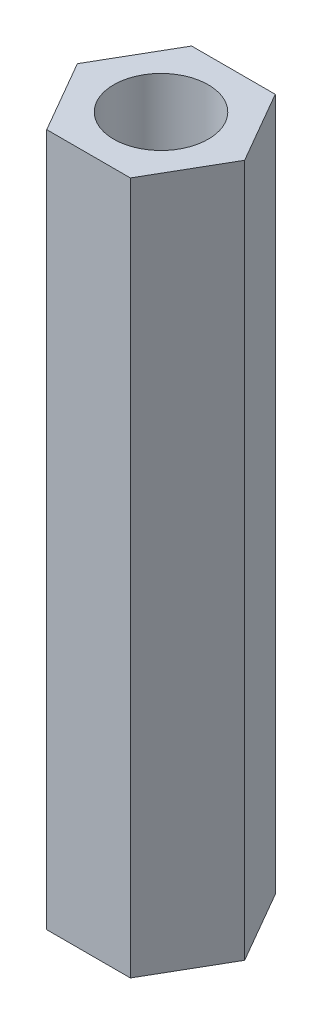
ISO-10303-21;
HEADER;
FILE_DESCRIPTION(('STEP AP214'),'2;1');
FILE_NAME('part.step','',(''),(''),'','','');
FILE_SCHEMA(('AUTOMOTIVE_DESIGN { 1 0 10303 214 1 1 1 1 }'));
ENDSEC;
DATA;
#1=APPLICATION_CONTEXT('core data for automotive mechanical design processes');
#2=APPLICATION_PROTOCOL_DEFINITION('international standard','automotive_design',2000,#1);
#3=PRODUCT_CONTEXT('',#1,'mechanical');
#4=PRODUCT('Part','Part','',(#3));
#5=PRODUCT_RELATED_PRODUCT_CATEGORY('part','',(#4));
#6=PRODUCT_DEFINITION_FORMATION('','',#4);
#7=PRODUCT_DEFINITION_CONTEXT('part definition',#1,'design');
#8=PRODUCT_DEFINITION('design','',#6,#7);
#9=PRODUCT_DEFINITION_SHAPE('','',#8);
#10=(LENGTH_UNIT() NAMED_UNIT(*) SI_UNIT(.MILLI.,.METRE.));
#11=(NAMED_UNIT(*) PLANE_ANGLE_UNIT() SI_UNIT($,.RADIAN.));
#12=(NAMED_UNIT(*) SI_UNIT($,.STERADIAN.) SOLID_ANGLE_UNIT());
#13=UNCERTAINTY_MEASURE_WITH_UNIT(LENGTH_MEASURE(1.E-05),#10,'distance_accuracy_value','');
#14=(GEOMETRIC_REPRESENTATION_CONTEXT(3) GLOBAL_UNCERTAINTY_ASSIGNED_CONTEXT((#13)) GLOBAL_UNIT_ASSIGNED_CONTEXT((#10,
#11,#12)) REPRESENTATION_CONTEXT('',''));
#15=CARTESIAN_POINT('',(0.,0.,0.));
#16=DIRECTION('',(0.,0.,1.));
#17=DIRECTION('',(1.,0.,0.));
#18=AXIS2_PLACEMENT_3D('',#15,#16,#17);
#19=CARTESIAN_POINT('',(2.65581123827228,22.,0.));
#20=DIRECTION('',(-0.866025403784438,0.,0.500000000000001));
#21=DIRECTION('',(0.500000000000001,0.,0.866025403784438));
#22=AXIS2_PLACEMENT_3D('',#19,#20,#21);
#23=PLANE('',#22);
#24=DIRECTION('',(0.,1.,0.));
#25=VECTOR('',#24,1.);
#26=CARTESIAN_POINT('',(1.32790561913614,22.,-2.3));
#27=LINE('',#26,#25);
#28=CARTESIAN_POINT('',(1.32790561913613,0.,-2.3));
#29=VERTEX_POINT('',#28);
#30=CARTESIAN_POINT('',(1.32790561913613,22.,-2.3));
#31=VERTEX_POINT('',#30);
#32=EDGE_CURVE('E83',#29,#31,#27,.T.);
#33=ORIENTED_EDGE('',*,*,#32,.T.);
#34=DIRECTION('',(-0.500000000000001,0.,-0.866025403784438));
#35=VECTOR('',#34,1.);
#36=CARTESIAN_POINT('',(2.65581123827228,22.,0.));
#37=LINE('',#36,#35);
#38=CARTESIAN_POINT('',(2.65581123827228,22.,0.));
#39=VERTEX_POINT('',#38);
#40=EDGE_CURVE('E79',#39,#31,#37,.T.);
#41=ORIENTED_EDGE('',*,*,#40,.F.);
#42=DIRECTION('',(0.,1.,0.));
#43=VECTOR('',#42,1.);
#44=CARTESIAN_POINT('',(2.65581123827228,22.,0.));
#45=LINE('',#44,#43);
#46=CARTESIAN_POINT('',(2.65581123827228,0.,0.));
#47=VERTEX_POINT('',#46);
#48=EDGE_CURVE('E67',#39,#47,#45,.F.);
#49=ORIENTED_EDGE('',*,*,#48,.T.);
#50=DIRECTION('',(-0.500000000000001,0.,-0.866025403784438));
#51=VECTOR('',#50,1.);
#52=CARTESIAN_POINT('',(2.65581123827228,0.,0.));
#53=LINE('',#52,#51);
#54=EDGE_CURVE('E116',#47,#29,#53,.T.);
#55=ORIENTED_EDGE('',*,*,#54,.T.);
#56=EDGE_LOOP('',(#33,#41,#49,#55));
#57=FACE_BOUND('',#56,.T.);
#58=ADVANCED_FACE('F16',(#57),#23,.F.);
#59=CARTESIAN_POINT('',(1.32790561913614,22.,-2.3));
#60=DIRECTION('',(0.,0.,1.));
#61=DIRECTION('',(1.,0.,0.));
#62=AXIS2_PLACEMENT_3D('',#59,#60,#61);
#63=PLANE('',#62);
#64=DIRECTION('',(0.,1.,0.));
#65=VECTOR('',#64,1.);
#66=CARTESIAN_POINT('',(-1.32790561913615,22.,-2.3));
#67=LINE('',#66,#65);
#68=CARTESIAN_POINT('',(-1.32790561913615,0.,-2.3));
#69=VERTEX_POINT('',#68);
#70=CARTESIAN_POINT('',(-1.32790561913615,22.,-2.3));
#71=VERTEX_POINT('',#70);
#72=EDGE_CURVE('E98',#69,#71,#67,.T.);
#73=ORIENTED_EDGE('',*,*,#72,.T.);
#74=DIRECTION('',(1.,0.,0.));
#75=VECTOR('',#74,1.);
#76=CARTESIAN_POINT('',(0.,22.,-2.3));
#77=LINE('',#76,#75);
#78=EDGE_CURVE('E85',#31,#71,#77,.F.);
#79=ORIENTED_EDGE('',*,*,#78,.F.);
#80=ORIENTED_EDGE('',*,*,#32,.F.);
#81=DIRECTION('',(1.,0.,0.));
#82=VECTOR('',#81,1.);
#83=CARTESIAN_POINT('',(0.,0.,-2.3));
#84=LINE('',#83,#82);
#85=EDGE_CURVE('E106',#29,#69,#84,.F.);
#86=ORIENTED_EDGE('',*,*,#85,.T.);
#87=EDGE_LOOP('',(#73,#79,#80,#86));
#88=FACE_BOUND('',#87,.T.);
#89=ADVANCED_FACE('F104',(#88),#63,.F.);
#90=CARTESIAN_POINT('',(-1.32790561913615,22.,-2.3));
#91=DIRECTION('',(0.866025403784442,0.,0.499999999999995));
#92=DIRECTION('',(0.499999999999995,0.,-0.866025403784442));
#93=AXIS2_PLACEMENT_3D('',#90,#91,#92);
#94=PLANE('',#93);
#95=DIRECTION('',(0.,1.,0.));
#96=VECTOR('',#95,1.);
#97=CARTESIAN_POINT('',(-2.65581123827228,22.,0.));
#98=LINE('',#97,#96);
#99=CARTESIAN_POINT('',(-2.65581123827228,0.,0.));
#100=VERTEX_POINT('',#99);
#101=CARTESIAN_POINT('',(-2.65581123827228,22.,0.));
#102=VERTEX_POINT('',#101);
#103=EDGE_CURVE('E95',#100,#102,#98,.T.);
#104=ORIENTED_EDGE('',*,*,#103,.T.);
#105=DIRECTION('',(-0.499999999999995,0.,0.866025403784442));
#106=VECTOR('',#105,1.);
#107=CARTESIAN_POINT('',(-1.32790561913615,22.,-2.3));
#108=LINE('',#107,#106);
#109=EDGE_CURVE('E87',#71,#102,#108,.T.);
#110=ORIENTED_EDGE('',*,*,#109,.F.);
#111=ORIENTED_EDGE('',*,*,#72,.F.);
#112=DIRECTION('',(-0.499999999999995,0.,0.866025403784442));
#113=VECTOR('',#112,1.);
#114=CARTESIAN_POINT('',(-1.32790561913615,0.,-2.3));
#115=LINE('',#114,#113);
#116=EDGE_CURVE('E119',#69,#100,#115,.T.);
#117=ORIENTED_EDGE('',*,*,#116,.T.);
#118=EDGE_LOOP('',(#104,#110,#111,#117));
#119=FACE_BOUND('',#118,.T.);
#120=ADVANCED_FACE('F110',(#119),#94,.F.);
#121=CARTESIAN_POINT('',(-2.65581123827228,22.,0.));
#122=DIRECTION('',(0.866025403784435,0.,-0.500000000000007));
#123=DIRECTION('',(-0.500000000000007,0.,-0.866025403784435));
#124=AXIS2_PLACEMENT_3D('',#121,#122,#123);
#125=PLANE('',#124);
#126=DIRECTION('',(0.,1.,0.));
#127=VECTOR('',#126,1.);
#128=CARTESIAN_POINT('',(-1.32790561913612,22.,2.30000000000001));
#129=LINE('',#128,#127);
#130=CARTESIAN_POINT('',(-1.32790561913612,0.,2.30000000000001));
#131=VERTEX_POINT('',#130);
#132=CARTESIAN_POINT('',(-1.32790561913612,22.,2.30000000000001));
#133=VERTEX_POINT('',#132);
#134=EDGE_CURVE('E92',#131,#133,#129,.T.);
#135=ORIENTED_EDGE('',*,*,#134,.T.);
#136=DIRECTION('',(0.500000000000007,0.,0.866025403784435));
#137=VECTOR('',#136,1.);
#138=CARTESIAN_POINT('',(-2.65581123827228,22.,0.));
#139=LINE('',#138,#137);
#140=EDGE_CURVE('E112',#102,#133,#139,.T.);
#141=ORIENTED_EDGE('',*,*,#140,.F.);
#142=ORIENTED_EDGE('',*,*,#103,.F.);
#143=DIRECTION('',(0.500000000000007,0.,0.866025403784435));
#144=VECTOR('',#143,1.);
#145=CARTESIAN_POINT('',(-2.65581123827228,0.,0.));
#146=LINE('',#145,#144);
#147=EDGE_CURVE('E121',#100,#131,#146,.T.);
#148=ORIENTED_EDGE('',*,*,#147,.T.);
#149=EDGE_LOOP('',(#135,#141,#142,#148));
#150=FACE_BOUND('',#149,.T.);
#151=ADVANCED_FACE('F151',(#150),#125,.F.);
#152=CARTESIAN_POINT('',(-1.32790561913612,22.,2.30000000000001));
#153=DIRECTION('',(0.,0.,-1.));
#154=DIRECTION('',(-1.,0.,0.));
#155=AXIS2_PLACEMENT_3D('',#152,#153,#154);
#156=PLANE('',#155);
#157=DIRECTION('',(0.,1.,0.));
#158=VECTOR('',#157,1.);
#159=CARTESIAN_POINT('',(1.32790561913617,22.,2.29999999999999));
#160=LINE('',#159,#158);
#161=CARTESIAN_POINT('',(1.32790561913616,0.,2.29999999999999));
#162=VERTEX_POINT('',#161);
#163=CARTESIAN_POINT('',(1.32790561913616,22.,2.29999999999999));
#164=VERTEX_POINT('',#163);
#165=EDGE_CURVE('E32',#162,#164,#160,.T.);
#166=ORIENTED_EDGE('',*,*,#165,.T.);
#167=DIRECTION('',(1.,0.,0.));
#168=VECTOR('',#167,1.);
#169=CARTESIAN_POINT('',(0.,22.,2.30000000000001));
#170=LINE('',#169,#168);
#171=EDGE_CURVE('E81',#133,#164,#170,.T.);
#172=ORIENTED_EDGE('',*,*,#171,.F.);
#173=ORIENTED_EDGE('',*,*,#134,.F.);
#174=DIRECTION('',(1.,0.,0.));
#175=VECTOR('',#174,1.);
#176=CARTESIAN_POINT('',(0.,0.,2.30000000000001));
#177=LINE('',#176,#175);
#178=EDGE_CURVE('E124',#131,#162,#177,.T.);
#179=ORIENTED_EDGE('',*,*,#178,.T.);
#180=EDGE_LOOP('',(#166,#172,#173,#179));
#181=FACE_BOUND('',#180,.T.);
#182=ADVANCED_FACE('F148',(#181),#156,.F.);
#183=CARTESIAN_POINT('',(1.32790561913617,22.,2.29999999999999));
#184=DIRECTION('',(-0.866025403784442,0.,-0.499999999999995));
#185=DIRECTION('',(-0.499999999999995,0.,0.866025403784442));
#186=AXIS2_PLACEMENT_3D('',#183,#184,#185);
#187=PLANE('',#186);
#188=ORIENTED_EDGE('',*,*,#48,.F.);
#189=DIRECTION('',(0.499999999999995,0.,-0.866025403784442));
#190=VECTOR('',#189,1.);
#191=CARTESIAN_POINT('',(1.32790561913617,22.,2.29999999999999));
#192=LINE('',#191,#190);
#193=EDGE_CURVE('E70',#164,#39,#192,.T.);
#194=ORIENTED_EDGE('',*,*,#193,.F.);
#195=ORIENTED_EDGE('',*,*,#165,.F.);
#196=DIRECTION('',(0.499999999999995,0.,-0.866025403784442));
#197=VECTOR('',#196,1.);
#198=CARTESIAN_POINT('',(1.32790561913617,0.,2.29999999999999));
#199=LINE('',#198,#197);
#200=EDGE_CURVE('E71',#162,#47,#199,.T.);
#201=ORIENTED_EDGE('',*,*,#200,.T.);
#202=EDGE_LOOP('',(#188,#194,#195,#201));
#203=FACE_BOUND('',#202,.T.);
#204=ADVANCED_FACE('F69',(#203),#187,.F.);
#205=CARTESIAN_POINT('',(0.,22.,0.));
#206=DIRECTION('',(0.,1.,0.));
#207=DIRECTION('',(0.,0.,1.));
#208=AXIS2_PLACEMENT_3D('',#205,#206,#207);
#209=PLANE('',#208);
#210=ORIENTED_EDGE('',*,*,#140,.T.);
#211=ORIENTED_EDGE('',*,*,#171,.T.);
#212=ORIENTED_EDGE('',*,*,#193,.T.);
#213=ORIENTED_EDGE('',*,*,#40,.T.);
#214=ORIENTED_EDGE('',*,*,#78,.T.);
#215=ORIENTED_EDGE('',*,*,#109,.T.);
#216=EDGE_LOOP('',(#210,#211,#212,#213,#214,#215));
#217=FACE_BOUND('',#216,.T.);
#218=CARTESIAN_POINT('',(0.,22.,0.));
#219=DIRECTION('',(0.,1.,0.));
#220=DIRECTION('',(0.,0.,1.));
#221=AXIS2_PLACEMENT_3D('',#218,#219,#220);
#222=CIRCLE('',#221,1.5);
#223=CARTESIAN_POINT('',(0.,22.,1.5));
#224=VERTEX_POINT('',#223);
#225=EDGE_CURVE('E19',#224,#224,#222,.F.);
#226=ORIENTED_EDGE('',*,*,#225,.T.);
#227=EDGE_LOOP('',(#226));
#228=FACE_BOUND('',#227,.T.);
#229=ADVANCED_FACE('F77',(#217,#228),#209,.T.);
#230=CARTESIAN_POINT('',(0.,0.,0.));
#231=DIRECTION('',(0.,1.,0.));
#232=DIRECTION('',(0.,0.,1.));
#233=AXIS2_PLACEMENT_3D('',#230,#231,#232);
#234=PLANE('',#233);
#235=ORIENTED_EDGE('',*,*,#178,.F.);
#236=ORIENTED_EDGE('',*,*,#147,.F.);
#237=ORIENTED_EDGE('',*,*,#116,.F.);
#238=ORIENTED_EDGE('',*,*,#85,.F.);
#239=ORIENTED_EDGE('',*,*,#54,.F.);
#240=ORIENTED_EDGE('',*,*,#200,.F.);
#241=EDGE_LOOP('',(#235,#236,#237,#238,#239,#240));
#242=FACE_BOUND('',#241,.T.);
#243=CARTESIAN_POINT('',(0.,0.,0.));
#244=DIRECTION('',(0.,1.,0.));
#245=DIRECTION('',(0.,0.,1.));
#246=AXIS2_PLACEMENT_3D('',#243,#244,#245);
#247=CIRCLE('',#246,1.5);
#248=CARTESIAN_POINT('',(0.,0.,1.5));
#249=VERTEX_POINT('',#248);
#250=EDGE_CURVE('E11',#249,#249,#247,.T.);
#251=ORIENTED_EDGE('',*,*,#250,.T.);
#252=EDGE_LOOP('',(#251));
#253=FACE_BOUND('',#252,.T.);
#254=ADVANCED_FACE('F132',(#242,#253),#234,.F.);
#255=CARTESIAN_POINT('',(0.,0.,0.));
#256=DIRECTION('',(0.,1.,0.));
#257=DIRECTION('',(0.,0.,1.));
#258=AXIS2_PLACEMENT_3D('',#255,#256,#257);
#259=CYLINDRICAL_SURFACE('',#258,1.5);
#260=ORIENTED_EDGE('',*,*,#225,.F.);
#261=EDGE_LOOP('',(#260));
#262=FACE_BOUND('',#261,.T.);
#263=ORIENTED_EDGE('',*,*,#250,.F.);
#264=EDGE_LOOP('',(#263));
#265=FACE_BOUND('',#264,.T.);
#266=ADVANCED_FACE('F129',(#262,#265),#259,.F.);
#267=CLOSED_SHELL('',(#58,#89,#120,#151,#182,#204,#229,#254,#266));
#268=MANIFOLD_SOLID_BREP('B1',#267);
#269=ADVANCED_BREP_SHAPE_REPRESENTATION('',(#18,#268),#14);
#270=SHAPE_DEFINITION_REPRESENTATION(#9,#269);
ENDSEC;
END-ISO-10303-21;
